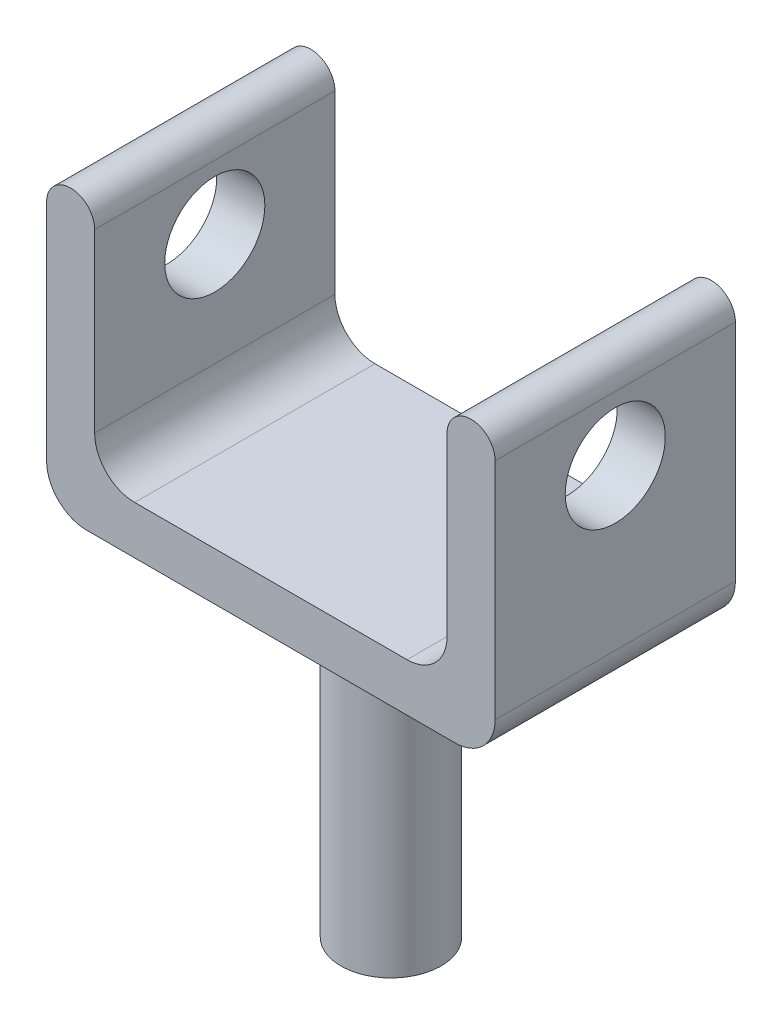
ISO-10303-21;
HEADER;
FILE_DESCRIPTION(('STEP AP214'),'2;1');
FILE_NAME('part.step','',(''),(''),'','','');
FILE_SCHEMA(('AUTOMOTIVE_DESIGN { 1 0 10303 214 1 1 1 1 }'));
ENDSEC;
DATA;
#1=APPLICATION_CONTEXT('core data for automotive mechanical design processes');
#2=APPLICATION_PROTOCOL_DEFINITION('international standard','automotive_design',2000,#1);
#3=PRODUCT_CONTEXT('',#1,'mechanical');
#4=PRODUCT('Part','Part','',(#3));
#5=PRODUCT_RELATED_PRODUCT_CATEGORY('part','',(#4));
#6=PRODUCT_DEFINITION_FORMATION('','',#4);
#7=PRODUCT_DEFINITION_CONTEXT('part definition',#1,'design');
#8=PRODUCT_DEFINITION('design','',#6,#7);
#9=PRODUCT_DEFINITION_SHAPE('','',#8);
#10=(LENGTH_UNIT() NAMED_UNIT(*) SI_UNIT(.MILLI.,.METRE.));
#11=(NAMED_UNIT(*) PLANE_ANGLE_UNIT() SI_UNIT($,.RADIAN.));
#12=(NAMED_UNIT(*) SI_UNIT($,.STERADIAN.) SOLID_ANGLE_UNIT());
#13=UNCERTAINTY_MEASURE_WITH_UNIT(LENGTH_MEASURE(1.E-05),#10,'distance_accuracy_value','');
#14=(GEOMETRIC_REPRESENTATION_CONTEXT(3) GLOBAL_UNCERTAINTY_ASSIGNED_CONTEXT((#13)) GLOBAL_UNIT_ASSIGNED_CONTEXT((#10,
#11,#12)) REPRESENTATION_CONTEXT('',''));
#15=CARTESIAN_POINT('',(0.,0.,0.));
#16=DIRECTION('',(0.,0.,1.));
#17=DIRECTION('',(1.,0.,0.));
#18=AXIS2_PLACEMENT_3D('',#15,#16,#17);
#19=CARTESIAN_POINT('',(24.1688311688312,0.,30.));
#20=DIRECTION('',(-1.,0.,0.));
#21=DIRECTION('',(0.,0.,1.));
#22=AXIS2_PLACEMENT_3D('',#19,#20,#21);
#23=PLANE('',#22);
#24=CARTESIAN_POINT('',(24.1688311688312,22.,15.));
#25=DIRECTION('',(-1.,0.,0.));
#26=DIRECTION('',(0.,0.,1.));
#27=AXIS2_PLACEMENT_3D('',#24,#25,#26);
#28=CIRCLE('',#27,6.25);
#29=CARTESIAN_POINT('',(24.1688311688312,22.,21.25));
#30=VERTEX_POINT('',#29);
#31=EDGE_CURVE('E463',#30,#30,#28,.T.);
#32=ORIENTED_EDGE('',*,*,#31,.T.);
#33=EDGE_LOOP('',(#32));
#34=FACE_BOUND('',#33,.T.);
#35=DIRECTION('',(0.,1.,0.));
#36=VECTOR('',#35,1.);
#37=CARTESIAN_POINT('',(24.1688311688312,0.,30.));
#38=LINE('',#37,#36);
#39=CARTESIAN_POINT('',(24.1688311688312,2.,30.));
#40=VERTEX_POINT('',#39);
#41=CARTESIAN_POINT('',(24.1688311688312,30.,30.));
#42=VERTEX_POINT('',#41);
#43=EDGE_CURVE('E132',#40,#42,#38,.T.);
#44=ORIENTED_EDGE('',*,*,#43,.F.);
#45=DIRECTION('',(0.,0.,-1.));
#46=VECTOR('',#45,1.);
#47=CARTESIAN_POINT('',(24.1688311688312,2.,30.));
#48=LINE('',#47,#46);
#49=CARTESIAN_POINT('',(24.1688311688312,2.,0.));
#50=VERTEX_POINT('',#49);
#51=EDGE_CURVE('E197',#40,#50,#48,.T.);
#52=ORIENTED_EDGE('',*,*,#51,.T.);
#53=DIRECTION('',(0.,1.,0.));
#54=VECTOR('',#53,1.);
#55=CARTESIAN_POINT('',(24.1688311688312,0.,0.));
#56=LINE('',#55,#54);
#57=CARTESIAN_POINT('',(24.1688311688312,30.,0.));
#58=VERTEX_POINT('',#57);
#59=EDGE_CURVE('E157',#50,#58,#56,.T.);
#60=ORIENTED_EDGE('',*,*,#59,.T.);
#61=DIRECTION('',(0.,0.,-1.));
#62=VECTOR('',#61,1.);
#63=CARTESIAN_POINT('',(24.1688311688312,30.,30.));
#64=LINE('',#63,#62);
#65=EDGE_CURVE('E151',#42,#58,#64,.T.);
#66=ORIENTED_EDGE('',*,*,#65,.F.);
#67=EDGE_LOOP('',(#44,#52,#60,#66));
#68=FACE_BOUND('',#67,.T.);
#69=ADVANCED_FACE('F41',(#34,#68),#23,.F.);
#70=CARTESIAN_POINT('',(21.1688311688312,30.,30.));
#71=DIRECTION('',(0.,0.,-1.));
#72=DIRECTION('',(-1.,0.,0.));
#73=AXIS2_PLACEMENT_3D('',#70,#71,#72);
#74=CYLINDRICAL_SURFACE('',#73,3.);
#75=CARTESIAN_POINT('',(21.1688311688312,30.,0.));
#76=DIRECTION('',(0.,0.,1.));
#77=DIRECTION('',(1.,0.,0.));
#78=AXIS2_PLACEMENT_3D('',#75,#76,#77);
#79=CIRCLE('',#78,3.);
#80=CARTESIAN_POINT('',(18.1688311688312,30.,0.));
#81=VERTEX_POINT('',#80);
#82=EDGE_CURVE('E224',#58,#81,#79,.T.);
#83=ORIENTED_EDGE('',*,*,#82,.T.);
#84=DIRECTION('',(0.,0.,-1.));
#85=VECTOR('',#84,1.);
#86=CARTESIAN_POINT('',(18.1688311688312,30.,30.));
#87=LINE('',#86,#85);
#88=CARTESIAN_POINT('',(18.1688311688312,30.,30.));
#89=VERTEX_POINT('',#88);
#90=EDGE_CURVE('E153',#89,#81,#87,.T.);
#91=ORIENTED_EDGE('',*,*,#90,.F.);
#92=CARTESIAN_POINT('',(21.1688311688312,30.,30.));
#93=DIRECTION('',(0.,0.,1.));
#94=DIRECTION('',(1.,0.,0.));
#95=AXIS2_PLACEMENT_3D('',#92,#93,#94);
#96=CIRCLE('',#95,3.);
#97=EDGE_CURVE('E136',#42,#89,#96,.T.);
#98=ORIENTED_EDGE('',*,*,#97,.F.);
#99=ORIENTED_EDGE('',*,*,#65,.T.);
#100=EDGE_LOOP('',(#83,#91,#98,#99));
#101=FACE_BOUND('',#100,.T.);
#102=ADVANCED_FACE('F150',(#101),#74,.T.);
#103=CARTESIAN_POINT('',(18.1688311688312,0.,30.));
#104=DIRECTION('',(-1.,0.,0.));
#105=DIRECTION('',(0.,0.,1.));
#106=AXIS2_PLACEMENT_3D('',#103,#104,#105);
#107=PLANE('',#106);
#108=CARTESIAN_POINT('',(18.1688311688312,22.,15.));
#109=DIRECTION('',(-1.,0.,0.));
#110=DIRECTION('',(0.,0.,1.));
#111=AXIS2_PLACEMENT_3D('',#108,#109,#110);
#112=CIRCLE('',#111,6.25);
#113=CARTESIAN_POINT('',(18.1688311688312,22.,21.25));
#114=VERTEX_POINT('',#113);
#115=EDGE_CURVE('E466',#114,#114,#112,.T.);
#116=ORIENTED_EDGE('',*,*,#115,.F.);
#117=EDGE_LOOP('',(#116));
#118=FACE_BOUND('',#117,.T.);
#119=DIRECTION('',(0.,1.,0.));
#120=VECTOR('',#119,1.);
#121=CARTESIAN_POINT('',(18.1688311688312,0.,0.));
#122=LINE('',#121,#120);
#123=CARTESIAN_POINT('',(18.1688311688312,8.,0.));
#124=VERTEX_POINT('',#123);
#125=EDGE_CURVE('E215',#124,#81,#122,.T.);
#126=ORIENTED_EDGE('',*,*,#125,.F.);
#127=DIRECTION('',(0.,0.,-1.));
#128=VECTOR('',#127,1.);
#129=CARTESIAN_POINT('',(18.1688311688312,8.,30.));
#130=LINE('',#129,#128);
#131=CARTESIAN_POINT('',(18.1688311688312,8.,30.));
#132=VERTEX_POINT('',#131);
#133=EDGE_CURVE('E194',#124,#132,#130,.F.);
#134=ORIENTED_EDGE('',*,*,#133,.T.);
#135=DIRECTION('',(0.,1.,0.));
#136=VECTOR('',#135,1.);
#137=CARTESIAN_POINT('',(18.1688311688312,0.,30.));
#138=LINE('',#137,#136);
#139=EDGE_CURVE('E155',#132,#89,#138,.T.);
#140=ORIENTED_EDGE('',*,*,#139,.T.);
#141=ORIENTED_EDGE('',*,*,#90,.T.);
#142=EDGE_LOOP('',(#126,#134,#140,#141));
#143=FACE_BOUND('',#142,.T.);
#144=ADVANCED_FACE('F222',(#118,#143),#107,.T.);
#145=CARTESIAN_POINT('',(0.,3.,30.));
#146=DIRECTION('',(0.,1.,0.));
#147=DIRECTION('',(0.,0.,1.));
#148=AXIS2_PLACEMENT_3D('',#145,#146,#147);
#149=PLANE('',#148);
#150=DIRECTION('',(1.,0.,0.));
#151=VECTOR('',#150,1.);
#152=CARTESIAN_POINT('',(0.,3.,0.));
#153=LINE('',#152,#151);
#154=CARTESIAN_POINT('',(-20.8311688311688,3.,0.));
#155=VERTEX_POINT('',#154);
#156=CARTESIAN_POINT('',(13.1688311688312,3.,0.));
#157=VERTEX_POINT('',#156);
#158=EDGE_CURVE('E217',#155,#157,#153,.T.);
#159=ORIENTED_EDGE('',*,*,#158,.F.);
#160=DIRECTION('',(0.,0.,-1.));
#161=VECTOR('',#160,1.);
#162=CARTESIAN_POINT('',(-20.8311688311688,3.,30.));
#163=LINE('',#162,#161);
#164=CARTESIAN_POINT('',(-20.8311688311688,3.,30.));
#165=VERTEX_POINT('',#164);
#166=EDGE_CURVE('E191',#155,#165,#163,.F.);
#167=ORIENTED_EDGE('',*,*,#166,.T.);
#168=DIRECTION('',(1.,0.,0.));
#169=VECTOR('',#168,1.);
#170=CARTESIAN_POINT('',(0.,3.,30.));
#171=LINE('',#170,#169);
#172=CARTESIAN_POINT('',(13.1688311688312,3.,30.));
#173=VERTEX_POINT('',#172);
#174=EDGE_CURVE('E230',#165,#173,#171,.T.);
#175=ORIENTED_EDGE('',*,*,#174,.T.);
#176=DIRECTION('',(0.,0.,-1.));
#177=VECTOR('',#176,1.);
#178=CARTESIAN_POINT('',(13.1688311688312,3.,0.));
#179=LINE('',#178,#177);
#180=EDGE_CURVE('E187',#173,#157,#179,.T.);
#181=ORIENTED_EDGE('',*,*,#180,.T.);
#182=EDGE_LOOP('',(#159,#167,#175,#181));
#183=FACE_BOUND('',#182,.T.);
#184=ADVANCED_FACE('F233',(#183),#149,.T.);
#185=CARTESIAN_POINT('',(-25.8311688311688,0.,30.));
#186=DIRECTION('',(1.,0.,0.));
#187=DIRECTION('',(0.,0.,-1.));
#188=AXIS2_PLACEMENT_3D('',#185,#186,#187);
#189=PLANE('',#188);
#190=CARTESIAN_POINT('',(-25.8311688311688,22.,15.));
#191=DIRECTION('',(1.,0.,0.));
#192=DIRECTION('',(0.,0.,-1.));
#193=AXIS2_PLACEMENT_3D('',#190,#191,#192);
#194=CIRCLE('',#193,6.25);
#195=CARTESIAN_POINT('',(-25.8311688311688,22.,8.75));
#196=VERTEX_POINT('',#195);
#197=EDGE_CURVE('E471',#196,#196,#194,.T.);
#198=ORIENTED_EDGE('',*,*,#197,.F.);
#199=EDGE_LOOP('',(#198));
#200=FACE_BOUND('',#199,.T.);
#201=DIRECTION('',(0.,-1.,0.));
#202=VECTOR('',#201,1.);
#203=CARTESIAN_POINT('',(-25.8311688311688,0.,30.));
#204=LINE('',#203,#202);
#205=CARTESIAN_POINT('',(-25.8311688311688,30.,30.));
#206=VERTEX_POINT('',#205);
#207=CARTESIAN_POINT('',(-25.8311688311688,8.,30.));
#208=VERTEX_POINT('',#207);
#209=EDGE_CURVE('E236',#206,#208,#204,.T.);
#210=ORIENTED_EDGE('',*,*,#209,.T.);
#211=DIRECTION('',(0.,0.,-1.));
#212=VECTOR('',#211,1.);
#213=CARTESIAN_POINT('',(-25.8311688311688,8.,0.));
#214=LINE('',#213,#212);
#215=CARTESIAN_POINT('',(-25.8311688311688,8.,0.));
#216=VERTEX_POINT('',#215);
#217=EDGE_CURVE('E183',#208,#216,#214,.T.);
#218=ORIENTED_EDGE('',*,*,#217,.T.);
#219=DIRECTION('',(0.,-1.,0.));
#220=VECTOR('',#219,1.);
#221=CARTESIAN_POINT('',(-25.8311688311688,0.,0.));
#222=LINE('',#221,#220);
#223=CARTESIAN_POINT('',(-25.8311688311688,30.,0.));
#224=VERTEX_POINT('',#223);
#225=EDGE_CURVE('E263',#224,#216,#222,.T.);
#226=ORIENTED_EDGE('',*,*,#225,.F.);
#227=DIRECTION('',(0.,0.,-1.));
#228=VECTOR('',#227,1.);
#229=CARTESIAN_POINT('',(-25.8311688311688,30.,30.));
#230=LINE('',#229,#228);
#231=EDGE_CURVE('E167',#206,#224,#230,.T.);
#232=ORIENTED_EDGE('',*,*,#231,.F.);
#233=EDGE_LOOP('',(#210,#218,#226,#232));
#234=FACE_BOUND('',#233,.T.);
#235=ADVANCED_FACE('F286',(#200,#234),#189,.T.);
#236=CARTESIAN_POINT('',(-28.8311688311688,30.,30.));
#237=DIRECTION('',(0.,0.,-1.));
#238=DIRECTION('',(-1.,0.,0.));
#239=AXIS2_PLACEMENT_3D('',#236,#237,#238);
#240=CYLINDRICAL_SURFACE('',#239,3.);
#241=CARTESIAN_POINT('',(-28.8311688311688,30.,0.));
#242=DIRECTION('',(0.,0.,1.));
#243=DIRECTION('',(1.,0.,0.));
#244=AXIS2_PLACEMENT_3D('',#241,#242,#243);
#245=CIRCLE('',#244,3.);
#246=CARTESIAN_POINT('',(-31.8311688311688,30.,0.));
#247=VERTEX_POINT('',#246);
#248=EDGE_CURVE('E267',#247,#224,#245,.F.);
#249=ORIENTED_EDGE('',*,*,#248,.F.);
#250=DIRECTION('',(0.,0.,-1.));
#251=VECTOR('',#250,1.);
#252=CARTESIAN_POINT('',(-31.8311688311688,30.,30.));
#253=LINE('',#252,#251);
#254=CARTESIAN_POINT('',(-31.8311688311688,30.,30.));
#255=VERTEX_POINT('',#254);
#256=EDGE_CURVE('E255',#255,#247,#253,.T.);
#257=ORIENTED_EDGE('',*,*,#256,.F.);
#258=CARTESIAN_POINT('',(-28.8311688311688,30.,30.));
#259=DIRECTION('',(0.,0.,1.));
#260=DIRECTION('',(1.,0.,0.));
#261=AXIS2_PLACEMENT_3D('',#258,#259,#260);
#262=CIRCLE('',#261,3.);
#263=EDGE_CURVE('E241',#255,#206,#262,.F.);
#264=ORIENTED_EDGE('',*,*,#263,.T.);
#265=ORIENTED_EDGE('',*,*,#231,.T.);
#266=EDGE_LOOP('',(#249,#257,#264,#265));
#267=FACE_BOUND('',#266,.T.);
#268=ADVANCED_FACE('F282',(#267),#240,.T.);
#269=CARTESIAN_POINT('',(-31.8311688311688,0.,30.));
#270=DIRECTION('',(1.,0.,0.));
#271=DIRECTION('',(0.,0.,-1.));
#272=AXIS2_PLACEMENT_3D('',#269,#270,#271);
#273=PLANE('',#272);
#274=CARTESIAN_POINT('',(-31.8311688311688,22.,15.));
#275=DIRECTION('',(-1.,0.,0.));
#276=DIRECTION('',(0.,0.,1.));
#277=AXIS2_PLACEMENT_3D('',#274,#275,#276);
#278=CIRCLE('',#277,6.25);
#279=CARTESIAN_POINT('',(-31.8311688311688,22.,21.25));
#280=VERTEX_POINT('',#279);
#281=EDGE_CURVE('E475',#280,#280,#278,.T.);
#282=ORIENTED_EDGE('',*,*,#281,.F.);
#283=EDGE_LOOP('',(#282));
#284=FACE_BOUND('',#283,.T.);
#285=DIRECTION('',(0.,-1.,0.));
#286=VECTOR('',#285,1.);
#287=CARTESIAN_POINT('',(-31.8311688311688,0.,0.));
#288=LINE('',#287,#286);
#289=CARTESIAN_POINT('',(-31.8311688311688,2.,0.));
#290=VERTEX_POINT('',#289);
#291=EDGE_CURVE('E271',#247,#290,#288,.T.);
#292=ORIENTED_EDGE('',*,*,#291,.T.);
#293=DIRECTION('',(0.,0.,-1.));
#294=VECTOR('',#293,1.);
#295=CARTESIAN_POINT('',(-31.8311688311688,2.,30.));
#296=LINE('',#295,#294);
#297=CARTESIAN_POINT('',(-31.8311688311688,2.,30.));
#298=VERTEX_POINT('',#297);
#299=EDGE_CURVE('E177',#290,#298,#296,.F.);
#300=ORIENTED_EDGE('',*,*,#299,.T.);
#301=DIRECTION('',(0.,-1.,0.));
#302=VECTOR('',#301,1.);
#303=CARTESIAN_POINT('',(-31.8311688311688,0.,30.));
#304=LINE('',#303,#302);
#305=EDGE_CURVE('E248',#255,#298,#304,.T.);
#306=ORIENTED_EDGE('',*,*,#305,.F.);
#307=ORIENTED_EDGE('',*,*,#256,.T.);
#308=EDGE_LOOP('',(#292,#300,#306,#307));
#309=FACE_BOUND('',#308,.T.);
#310=ADVANCED_FACE('F291',(#284,#309),#273,.F.);
#311=CARTESIAN_POINT('',(0.,-3.,30.));
#312=DIRECTION('',(0.,1.,0.));
#313=DIRECTION('',(0.,0.,1.));
#314=AXIS2_PLACEMENT_3D('',#311,#312,#313);
#315=PLANE('',#314);
#316=CARTESIAN_POINT('',(-3.83116883116882,-3.,15.));
#317=DIRECTION('',(0.,-1.,0.));
#318=DIRECTION('',(0.,0.,-1.));
#319=AXIS2_PLACEMENT_3D('',#316,#317,#318);
#320=CIRCLE('',#319,6.25);
#321=CARTESIAN_POINT('',(-3.83116883116882,-3.,8.75));
#322=VERTEX_POINT('',#321);
#323=EDGE_CURVE('E160',#322,#322,#320,.T.);
#324=ORIENTED_EDGE('',*,*,#323,.F.);
#325=EDGE_LOOP('',(#324));
#326=FACE_BOUND('',#325,.T.);
#327=DIRECTION('',(1.,0.,0.));
#328=VECTOR('',#327,1.);
#329=CARTESIAN_POINT('',(0.,-3.,0.));
#330=LINE('',#329,#328);
#331=CARTESIAN_POINT('',(-26.8311688311688,-3.,0.));
#332=VERTEX_POINT('',#331);
#333=CARTESIAN_POINT('',(19.1688311688312,-3.,0.));
#334=VERTEX_POINT('',#333);
#335=EDGE_CURVE('E145',#332,#334,#330,.T.);
#336=ORIENTED_EDGE('',*,*,#335,.T.);
#337=DIRECTION('',(0.,0.,-1.));
#338=VECTOR('',#337,1.);
#339=CARTESIAN_POINT('',(19.1688311688312,-3.,30.));
#340=LINE('',#339,#338);
#341=CARTESIAN_POINT('',(19.1688311688312,-3.,30.));
#342=VERTEX_POINT('',#341);
#343=EDGE_CURVE('E57',#334,#342,#340,.F.);
#344=ORIENTED_EDGE('',*,*,#343,.T.);
#345=DIRECTION('',(1.,0.,0.));
#346=VECTOR('',#345,1.);
#347=CARTESIAN_POINT('',(0.,-3.,30.));
#348=LINE('',#347,#346);
#349=CARTESIAN_POINT('',(-26.8311688311688,-3.,30.));
#350=VERTEX_POINT('',#349);
#351=EDGE_CURVE('E252',#350,#342,#348,.T.);
#352=ORIENTED_EDGE('',*,*,#351,.F.);
#353=DIRECTION('',(0.,0.,-1.));
#354=VECTOR('',#353,1.);
#355=CARTESIAN_POINT('',(-26.8311688311688,-3.,30.));
#356=LINE('',#355,#354);
#357=EDGE_CURVE('E165',#350,#332,#356,.T.);
#358=ORIENTED_EDGE('',*,*,#357,.T.);
#359=EDGE_LOOP('',(#336,#344,#352,#358));
#360=FACE_BOUND('',#359,.T.);
#361=ADVANCED_FACE('F297',(#326,#360),#315,.F.);
#362=CARTESIAN_POINT('',(0.,0.,30.));
#363=DIRECTION('',(0.,0.,1.));
#364=DIRECTION('',(1.,0.,0.));
#365=AXIS2_PLACEMENT_3D('',#362,#363,#364);
#366=PLANE('',#365);
#367=ORIENTED_EDGE('',*,*,#351,.T.);
#368=CARTESIAN_POINT('',(19.1688311688312,2.,30.));
#369=DIRECTION('',(0.,0.,1.));
#370=DIRECTION('',(1.,0.,0.));
#371=AXIS2_PLACEMENT_3D('',#368,#369,#370);
#372=CIRCLE('',#371,5.);
#373=EDGE_CURVE('E139',#342,#40,#372,.T.);
#374=ORIENTED_EDGE('',*,*,#373,.T.);
#375=ORIENTED_EDGE('',*,*,#43,.T.);
#376=ORIENTED_EDGE('',*,*,#97,.T.);
#377=ORIENTED_EDGE('',*,*,#139,.F.);
#378=CARTESIAN_POINT('',(13.1688311688312,8.,30.));
#379=DIRECTION('',(0.,0.,1.));
#380=DIRECTION('',(1.,0.,0.));
#381=AXIS2_PLACEMENT_3D('',#378,#379,#380);
#382=CIRCLE('',#381,5.);
#383=EDGE_CURVE('E11',#132,#173,#382,.F.);
#384=ORIENTED_EDGE('',*,*,#383,.T.);
#385=ORIENTED_EDGE('',*,*,#174,.F.);
#386=CARTESIAN_POINT('',(-20.8311688311688,8.,30.));
#387=DIRECTION('',(0.,0.,1.));
#388=DIRECTION('',(1.,0.,0.));
#389=AXIS2_PLACEMENT_3D('',#386,#387,#388);
#390=CIRCLE('',#389,5.);
#391=EDGE_CURVE('E209',#165,#208,#390,.F.);
#392=ORIENTED_EDGE('',*,*,#391,.T.);
#393=ORIENTED_EDGE('',*,*,#209,.F.);
#394=ORIENTED_EDGE('',*,*,#263,.F.);
#395=ORIENTED_EDGE('',*,*,#305,.T.);
#396=CARTESIAN_POINT('',(-26.8311688311688,2.,30.));
#397=DIRECTION('',(0.,0.,1.));
#398=DIRECTION('',(1.,0.,0.));
#399=AXIS2_PLACEMENT_3D('',#396,#397,#398);
#400=CIRCLE('',#399,5.);
#401=EDGE_CURVE('E180',#298,#350,#400,.T.);
#402=ORIENTED_EDGE('',*,*,#401,.T.);
#403=EDGE_LOOP('',(#367,#374,#375,#376,#377,#384,#385,#392,#393,#394,#395,#402));
#404=FACE_BOUND('',#403,.T.);
#405=ADVANCED_FACE('F134',(#404),#366,.T.);
#406=CARTESIAN_POINT('',(0.,0.,0.));
#407=DIRECTION('',(0.,0.,1.));
#408=DIRECTION('',(1.,0.,0.));
#409=AXIS2_PLACEMENT_3D('',#406,#407,#408);
#410=PLANE('',#409);
#411=ORIENTED_EDGE('',*,*,#59,.F.);
#412=CARTESIAN_POINT('',(19.1688311688312,2.,0.));
#413=DIRECTION('',(0.,0.,1.));
#414=DIRECTION('',(1.,0.,0.));
#415=AXIS2_PLACEMENT_3D('',#412,#413,#414);
#416=CIRCLE('',#415,5.);
#417=EDGE_CURVE('E65',#50,#334,#416,.F.);
#418=ORIENTED_EDGE('',*,*,#417,.T.);
#419=ORIENTED_EDGE('',*,*,#335,.F.);
#420=CARTESIAN_POINT('',(-26.8311688311688,2.,0.));
#421=DIRECTION('',(0.,0.,1.));
#422=DIRECTION('',(1.,0.,0.));
#423=AXIS2_PLACEMENT_3D('',#420,#421,#422);
#424=CIRCLE('',#423,5.);
#425=EDGE_CURVE('E174',#332,#290,#424,.F.);
#426=ORIENTED_EDGE('',*,*,#425,.T.);
#427=ORIENTED_EDGE('',*,*,#291,.F.);
#428=ORIENTED_EDGE('',*,*,#248,.T.);
#429=ORIENTED_EDGE('',*,*,#225,.T.);
#430=CARTESIAN_POINT('',(-20.8311688311688,8.,0.));
#431=DIRECTION('',(0.,0.,1.));
#432=DIRECTION('',(1.,0.,0.));
#433=AXIS2_PLACEMENT_3D('',#430,#431,#432);
#434=CIRCLE('',#433,5.);
#435=EDGE_CURVE('E206',#216,#155,#434,.T.);
#436=ORIENTED_EDGE('',*,*,#435,.T.);
#437=ORIENTED_EDGE('',*,*,#158,.T.);
#438=CARTESIAN_POINT('',(13.1688311688312,8.,0.));
#439=DIRECTION('',(0.,0.,1.));
#440=DIRECTION('',(1.,0.,0.));
#441=AXIS2_PLACEMENT_3D('',#438,#439,#440);
#442=CIRCLE('',#441,5.);
#443=EDGE_CURVE('E50',#157,#124,#442,.T.);
#444=ORIENTED_EDGE('',*,*,#443,.T.);
#445=ORIENTED_EDGE('',*,*,#125,.T.);
#446=ORIENTED_EDGE('',*,*,#82,.F.);
#447=EDGE_LOOP('',(#411,#418,#419,#426,#427,#428,#429,#436,#437,#444,#445,#446));
#448=FACE_BOUND('',#447,.T.);
#449=ADVANCED_FACE('F214',(#448),#410,.F.);
#450=CARTESIAN_POINT('',(-3.83116883116882,-43.,15.));
#451=DIRECTION('',(0.,1.,0.));
#452=DIRECTION('',(0.,0.,1.));
#453=AXIS2_PLACEMENT_3D('',#450,#451,#452);
#454=CYLINDRICAL_SURFACE('',#453,6.25);
#455=CARTESIAN_POINT('',(-3.83116883116882,-43.,15.));
#456=DIRECTION('',(0.,-1.,0.));
#457=DIRECTION('',(0.,0.,-1.));
#458=AXIS2_PLACEMENT_3D('',#455,#456,#457);
#459=CIRCLE('',#458,6.25);
#460=CARTESIAN_POINT('',(-3.83116883116882,-43.,8.75));
#461=VERTEX_POINT('',#460);
#462=EDGE_CURVE('E258',#461,#461,#459,.T.);
#463=ORIENTED_EDGE('',*,*,#462,.F.);
#464=EDGE_LOOP('',(#463));
#465=FACE_BOUND('',#464,.T.);
#466=ORIENTED_EDGE('',*,*,#323,.T.);
#467=EDGE_LOOP('',(#466));
#468=FACE_BOUND('',#467,.T.);
#469=ADVANCED_FACE('F397',(#465,#468),#454,.T.);
#470=CARTESIAN_POINT('',(-3.83116883116882,-43.,15.));
#471=DIRECTION('',(0.,-1.,0.));
#472=DIRECTION('',(0.,0.,-1.));
#473=AXIS2_PLACEMENT_3D('',#470,#471,#472);
#474=PLANE('',#473);
#475=ORIENTED_EDGE('',*,*,#462,.T.);
#476=EDGE_LOOP('',(#475));
#477=FACE_BOUND('',#476,.T.);
#478=ADVANCED_FACE('F321',(#477),#474,.T.);
#479=CARTESIAN_POINT('',(-26.8311688311688,2.,30.));
#480=DIRECTION('',(0.,0.,-1.));
#481=DIRECTION('',(-1.,0.,0.));
#482=AXIS2_PLACEMENT_3D('',#479,#480,#481);
#483=CYLINDRICAL_SURFACE('',#482,5.);
#484=ORIENTED_EDGE('',*,*,#401,.F.);
#485=ORIENTED_EDGE('',*,*,#299,.F.);
#486=ORIENTED_EDGE('',*,*,#425,.F.);
#487=ORIENTED_EDGE('',*,*,#357,.F.);
#488=EDGE_LOOP('',(#484,#485,#486,#487));
#489=FACE_BOUND('',#488,.T.);
#490=ADVANCED_FACE('F295',(#489),#483,.T.);
#491=CARTESIAN_POINT('',(-20.8311688311688,8.,30.));
#492=DIRECTION('',(0.,0.,1.));
#493=DIRECTION('',(1.,0.,0.));
#494=AXIS2_PLACEMENT_3D('',#491,#492,#493);
#495=CYLINDRICAL_SURFACE('',#494,5.);
#496=ORIENTED_EDGE('',*,*,#391,.F.);
#497=ORIENTED_EDGE('',*,*,#166,.F.);
#498=ORIENTED_EDGE('',*,*,#435,.F.);
#499=ORIENTED_EDGE('',*,*,#217,.F.);
#500=EDGE_LOOP('',(#496,#497,#498,#499));
#501=FACE_BOUND('',#500,.T.);
#502=ADVANCED_FACE('F308',(#501),#495,.F.);
#503=CARTESIAN_POINT('',(13.1688311688312,8.,30.));
#504=DIRECTION('',(0.,0.,1.));
#505=DIRECTION('',(1.,0.,0.));
#506=AXIS2_PLACEMENT_3D('',#503,#504,#505);
#507=CYLINDRICAL_SURFACE('',#506,5.);
#508=ORIENTED_EDGE('',*,*,#383,.F.);
#509=ORIENTED_EDGE('',*,*,#133,.F.);
#510=ORIENTED_EDGE('',*,*,#443,.F.);
#511=ORIENTED_EDGE('',*,*,#180,.F.);
#512=EDGE_LOOP('',(#508,#509,#510,#511));
#513=FACE_BOUND('',#512,.T.);
#514=ADVANCED_FACE('F227',(#513),#507,.F.);
#515=CARTESIAN_POINT('',(19.1688311688312,2.,30.));
#516=DIRECTION('',(0.,0.,-1.));
#517=DIRECTION('',(-1.,0.,0.));
#518=AXIS2_PLACEMENT_3D('',#515,#516,#517);
#519=CYLINDRICAL_SURFACE('',#518,5.);
#520=ORIENTED_EDGE('',*,*,#373,.F.);
#521=ORIENTED_EDGE('',*,*,#343,.F.);
#522=ORIENTED_EDGE('',*,*,#417,.F.);
#523=ORIENTED_EDGE('',*,*,#51,.F.);
#524=EDGE_LOOP('',(#520,#521,#522,#523));
#525=FACE_BOUND('',#524,.T.);
#526=ADVANCED_FACE('F43',(#525),#519,.T.);
#527=CARTESIAN_POINT('',(28.1688311688312,22.,15.));
#528=DIRECTION('',(-1.,0.,0.));
#529=DIRECTION('',(0.,0.,1.));
#530=AXIS2_PLACEMENT_3D('',#527,#528,#529);
#531=CYLINDRICAL_SURFACE('',#530,6.25);
#532=ORIENTED_EDGE('',*,*,#197,.T.);
#533=EDGE_LOOP('',(#532));
#534=FACE_BOUND('',#533,.T.);
#535=ORIENTED_EDGE('',*,*,#281,.T.);
#536=EDGE_LOOP('',(#535));
#537=FACE_BOUND('',#536,.T.);
#538=ADVANCED_FACE('F300',(#534,#537),#531,.F.);
#539=ORIENTED_EDGE('',*,*,#115,.T.);
#540=EDGE_LOOP('',(#539));
#541=FACE_BOUND('',#540,.T.);
#542=ORIENTED_EDGE('',*,*,#31,.F.);
#543=EDGE_LOOP('',(#542));
#544=FACE_BOUND('',#543,.T.);
#545=ADVANCED_FACE('F305',(#541,#544),#531,.F.);
#546=CLOSED_SHELL('',(#69,#102,#144,#184,#235,#268,#310,#361,#405,#449,#469,#478,#490,#502,#514,
#526,#538,#545));
#547=MANIFOLD_SOLID_BREP('B2',#546);
#548=ADVANCED_BREP_SHAPE_REPRESENTATION('',(#18,#547),#14);
#549=SHAPE_DEFINITION_REPRESENTATION(#9,#548);
ENDSEC;
END-ISO-10303-21;
